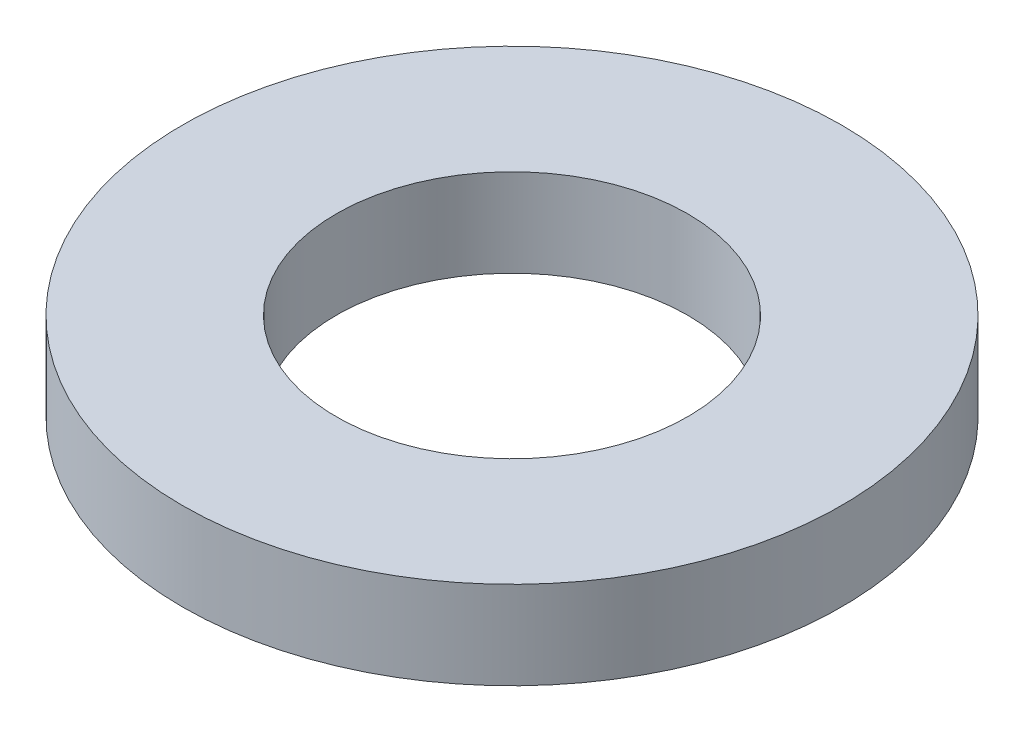
ISO-10303-21;
HEADER;
FILE_DESCRIPTION(('STEP AP214'),'2;1');
FILE_NAME('part.step','',(''),(''),'','','');
FILE_SCHEMA(('AUTOMOTIVE_DESIGN { 1 0 10303 214 1 1 1 1 }'));
ENDSEC;
DATA;
#1=APPLICATION_CONTEXT('core data for automotive mechanical design processes');
#2=APPLICATION_PROTOCOL_DEFINITION('international standard','automotive_design',2000,#1);
#3=PRODUCT_CONTEXT('',#1,'mechanical');
#4=PRODUCT('Part','Part','',(#3));
#5=PRODUCT_RELATED_PRODUCT_CATEGORY('part','',(#4));
#6=PRODUCT_DEFINITION_FORMATION('','',#4);
#7=PRODUCT_DEFINITION_CONTEXT('part definition',#1,'design');
#8=PRODUCT_DEFINITION('design','',#6,#7);
#9=PRODUCT_DEFINITION_SHAPE('','',#8);
#10=(LENGTH_UNIT() NAMED_UNIT(*) SI_UNIT(.MILLI.,.METRE.));
#11=(NAMED_UNIT(*) PLANE_ANGLE_UNIT() SI_UNIT($,.RADIAN.));
#12=(NAMED_UNIT(*) SI_UNIT($,.STERADIAN.) SOLID_ANGLE_UNIT());
#13=UNCERTAINTY_MEASURE_WITH_UNIT(LENGTH_MEASURE(1.E-05),#10,'distance_accuracy_value','');
#14=(GEOMETRIC_REPRESENTATION_CONTEXT(3) GLOBAL_UNCERTAINTY_ASSIGNED_CONTEXT((#13)) GLOBAL_UNIT_ASSIGNED_CONTEXT((#10,
#11,#12)) REPRESENTATION_CONTEXT('',''));
#15=CARTESIAN_POINT('',(0.,0.,0.));
#16=DIRECTION('',(0.,0.,1.));
#17=DIRECTION('',(1.,0.,0.));
#18=AXIS2_PLACEMENT_3D('',#15,#16,#17);
#19=CARTESIAN_POINT('',(0.,0.,0.));
#20=DIRECTION('',(0.,-1.,0.));
#21=DIRECTION('',(0.,0.,-1.));
#22=AXIS2_PLACEMENT_3D('',#19,#20,#21);
#23=CYLINDRICAL_SURFACE('',#22,3.);
#24=CARTESIAN_POINT('',(0.,0.8,0.));
#25=DIRECTION('',(0.,-1.,0.));
#26=DIRECTION('',(0.,0.,-1.));
#27=AXIS2_PLACEMENT_3D('',#24,#25,#26);
#28=CIRCLE('',#27,3.);
#29=CARTESIAN_POINT('',(0.,0.8,-3.));
#30=VERTEX_POINT('',#29);
#31=EDGE_CURVE('E46',#30,#30,#28,.T.);
#32=ORIENTED_EDGE('',*,*,#31,.T.);
#33=EDGE_LOOP('',(#32));
#34=FACE_BOUND('',#33,.T.);
#35=CARTESIAN_POINT('',(0.,0.,0.));
#36=DIRECTION('',(0.,-1.,0.));
#37=DIRECTION('',(0.,0.,-1.));
#38=AXIS2_PLACEMENT_3D('',#35,#36,#37);
#39=CIRCLE('',#38,3.);
#40=CARTESIAN_POINT('',(0.,0.,-3.));
#41=VERTEX_POINT('',#40);
#42=EDGE_CURVE('E10',#41,#41,#39,.T.);
#43=ORIENTED_EDGE('',*,*,#42,.F.);
#44=EDGE_LOOP('',(#43));
#45=FACE_BOUND('',#44,.T.);
#46=ADVANCED_FACE('F32',(#34,#45),#23,.T.);
#47=CARTESIAN_POINT('',(1.6,0.,0.));
#48=DIRECTION('',(0.,-1.,0.));
#49=DIRECTION('',(0.,0.,-1.));
#50=AXIS2_PLACEMENT_3D('',#47,#48,#49);
#51=PLANE('',#50);
#52=ORIENTED_EDGE('',*,*,#42,.T.);
#53=EDGE_LOOP('',(#52));
#54=FACE_BOUND('',#53,.T.);
#55=CARTESIAN_POINT('',(0.,0.,0.));
#56=DIRECTION('',(0.,-1.,0.));
#57=DIRECTION('',(0.,0.,-1.));
#58=AXIS2_PLACEMENT_3D('',#55,#56,#57);
#59=CIRCLE('',#58,1.6);
#60=CARTESIAN_POINT('',(0.,0.,-1.6));
#61=VERTEX_POINT('',#60);
#62=EDGE_CURVE('E38',#61,#61,#59,.T.);
#63=ORIENTED_EDGE('',*,*,#62,.F.);
#64=EDGE_LOOP('',(#63));
#65=FACE_BOUND('',#64,.T.);
#66=ADVANCED_FACE('F62',(#54,#65),#51,.T.);
#67=CARTESIAN_POINT('',(0.,0.,0.));
#68=DIRECTION('',(0.,-1.,0.));
#69=DIRECTION('',(0.,0.,-1.));
#70=AXIS2_PLACEMENT_3D('',#67,#68,#69);
#71=CYLINDRICAL_SURFACE('',#70,1.6);
#72=ORIENTED_EDGE('',*,*,#62,.T.);
#73=EDGE_LOOP('',(#72));
#74=FACE_BOUND('',#73,.T.);
#75=CARTESIAN_POINT('',(0.,0.799999999999999,0.));
#76=DIRECTION('',(0.,-1.,0.));
#77=DIRECTION('',(0.,0.,-1.));
#78=AXIS2_PLACEMENT_3D('',#75,#76,#77);
#79=CIRCLE('',#78,1.6);
#80=CARTESIAN_POINT('',(0.,0.799999999999999,-1.6));
#81=VERTEX_POINT('',#80);
#82=EDGE_CURVE('E42',#81,#81,#79,.T.);
#83=ORIENTED_EDGE('',*,*,#82,.F.);
#84=EDGE_LOOP('',(#83));
#85=FACE_BOUND('',#84,.T.);
#86=ADVANCED_FACE('F56',(#74,#85),#71,.F.);
#87=CARTESIAN_POINT('',(3.,0.799999999999999,0.));
#88=DIRECTION('',(0.,1.,0.));
#89=DIRECTION('',(0.,0.,1.));
#90=AXIS2_PLACEMENT_3D('',#87,#88,#89);
#91=PLANE('',#90);
#92=ORIENTED_EDGE('',*,*,#82,.T.);
#93=EDGE_LOOP('',(#92));
#94=FACE_BOUND('',#93,.T.);
#95=ORIENTED_EDGE('',*,*,#31,.F.);
#96=EDGE_LOOP('',(#95));
#97=FACE_BOUND('',#96,.T.);
#98=ADVANCED_FACE('F54',(#94,#97),#91,.T.);
#99=CLOSED_SHELL('',(#46,#66,#86,#98));
#100=MANIFOLD_SOLID_BREP('B2',#99);
#101=ADVANCED_BREP_SHAPE_REPRESENTATION('',(#18,#100),#14);
#102=SHAPE_DEFINITION_REPRESENTATION(#9,#101);
ENDSEC;
END-ISO-10303-21;
